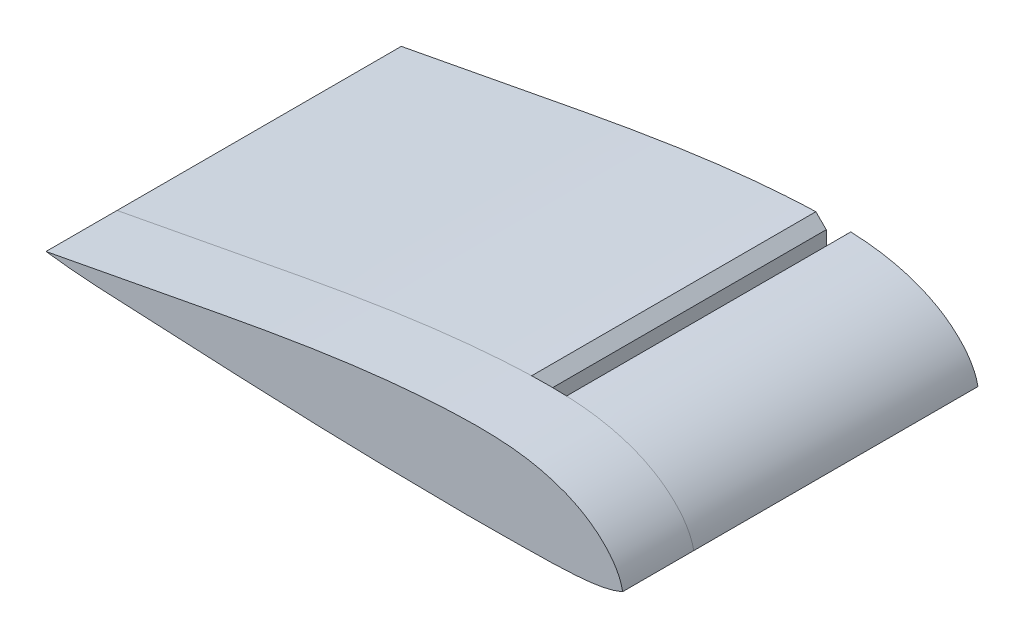
ISO-10303-21;
HEADER;
FILE_DESCRIPTION(('STEP AP214'),'2;1');
FILE_NAME('part.step','',(''),(''),'','','');
FILE_SCHEMA(('AUTOMOTIVE_DESIGN { 1 0 10303 214 1 1 1 1 }'));
ENDSEC;
DATA;
#1=APPLICATION_CONTEXT('core data for automotive mechanical design processes');
#2=APPLICATION_PROTOCOL_DEFINITION('international standard','automotive_design',2000,#1);
#3=PRODUCT_CONTEXT('',#1,'mechanical');
#4=PRODUCT('Part','Part','',(#3));
#5=PRODUCT_RELATED_PRODUCT_CATEGORY('part','',(#4));
#6=PRODUCT_DEFINITION_FORMATION('','',#4);
#7=PRODUCT_DEFINITION_CONTEXT('part definition',#1,'design');
#8=PRODUCT_DEFINITION('design','',#6,#7);
#9=PRODUCT_DEFINITION_SHAPE('','',#8);
#10=(LENGTH_UNIT() NAMED_UNIT(*) SI_UNIT(.MILLI.,.METRE.));
#11=(NAMED_UNIT(*) PLANE_ANGLE_UNIT() SI_UNIT($,.RADIAN.));
#12=(NAMED_UNIT(*) SI_UNIT($,.STERADIAN.) SOLID_ANGLE_UNIT());
#13=UNCERTAINTY_MEASURE_WITH_UNIT(LENGTH_MEASURE(1.E-05),#10,'distance_accuracy_value','');
#14=(GEOMETRIC_REPRESENTATION_CONTEXT(3) GLOBAL_UNCERTAINTY_ASSIGNED_CONTEXT((#13)) GLOBAL_UNIT_ASSIGNED_CONTEXT((#10,
#11,#12)) REPRESENTATION_CONTEXT('',''));
#15=CARTESIAN_POINT('',(0.,0.,0.));
#16=DIRECTION('',(0.,0.,1.));
#17=DIRECTION('',(1.,0.,0.));
#18=AXIS2_PLACEMENT_3D('',#15,#16,#17);
#19=CARTESIAN_POINT('',(0.0525468970362367,-5.46386928669368,40.));
#20=DIRECTION('',(0.,0.,1.));
#21=DIRECTION('',(1.,0.,0.));
#22=AXIS2_PLACEMENT_3D('',#19,#20,#21);
#23=PLANE('',#22);
#24=DIRECTION('',(0.707106781186548,-0.707106781186547,0.));
#25=VECTOR('',#24,1.);
#26=CARTESIAN_POINT('',(8.47373096715155,8.47373096715155,40.));
#27=LINE('',#26,#25);
#28=CARTESIAN_POINT('',(21.2277396024697,-4.28027766816662,40.));
#29=VERTEX_POINT('',#28);
#30=CARTESIAN_POINT('',(22.7130167791552,-5.76555478804223,40.));
#31=VERTEX_POINT('',#30);
#32=EDGE_CURVE('E72',#29,#31,#27,.T.);
#33=ORIENTED_EDGE('',*,*,#32,.T.);
#34=CARTESIAN_POINT('',(17.7318799767407,-5.77499139046754,40.));
#35=CARTESIAN_POINT('',(19.3922506443291,-5.78349573566027,40.));
#36=CARTESIAN_POINT('',(21.0527034694227,-5.78008344112582,40.));
#37=CARTESIAN_POINT('',(22.7130189897741,-5.76581451058722,40.));
#38=B_SPLINE_CURVE_WITH_KNOTS('',3,(#34,#35,#36,#37),.UNSPECIFIED.,.F.,.F.,(4,4),
(0.717206492162273,0.778393618965696),.UNSPECIFIED.);
#39=CARTESIAN_POINT('',(17.731533682026,-5.77554089475236,40.));
#40=VERTEX_POINT('',#39);
#41=EDGE_CURVE('E237',#40,#31,#38,.T.);
#42=ORIENTED_EDGE('',*,*,#41,.F.);
#43=DIRECTION('',(-0.707106781186544,-0.707106781186551,0.));
#44=VECTOR('',#43,1.);
#45=CARTESIAN_POINT('',(11.754008635319,-11.7540086353189,40.));
#46=LINE('',#45,#44);
#47=CARTESIAN_POINT('',(19.2277396024705,-4.28027766816735,40.));
#48=VERTEX_POINT('',#47);
#49=EDGE_CURVE('E438',#48,#40,#46,.T.);
#50=ORIENTED_EDGE('',*,*,#49,.F.);
#51=DIRECTION('',(0.,-1.,0.));
#52=VECTOR('',#51,1.);
#53=CARTESIAN_POINT('',(19.2277396024705,0.,40.));
#54=LINE('',#53,#52);
#55=CARTESIAN_POINT('',(19.2277396024705,4.26653509437403,40.));
#56=VERTEX_POINT('',#55);
#57=EDGE_CURVE('E353',#56,#48,#54,.T.);
#58=ORIENTED_EDGE('',*,*,#57,.F.);
#59=DIRECTION('',(0.707106781186548,-0.707106781186548,0.));
#60=VECTOR('',#59,1.);
#61=CARTESIAN_POINT('',(11.7471373484222,11.7471373484222,40.));
#62=LINE('',#61,#60);
#63=CARTESIAN_POINT('',(17.765326663135,5.72894839080767,40.));
#64=VERTEX_POINT('',#63);
#65=EDGE_CURVE('E392',#64,#56,#62,.T.);
#66=ORIENTED_EDGE('',*,*,#65,.F.);
#67=CARTESIAN_POINT('',(22.6796342102274,5.71872072456708,40.));
#68=CARTESIAN_POINT('',(21.0434973005353,5.78682796876243,40.));
#69=CARTESIAN_POINT('',(19.4033416538222,5.7761747385609,40.));
#70=CARTESIAN_POINT('',(17.7657952986475,5.72759658152388,40.));
#71=CARTESIAN_POINT('',(17.7653666065268,5.72758386167769,40.));
#72=B_SPLINE_CURVE_WITH_KNOTS('',3,(#67,#68,#69,#70,#71),.UNSPECIFIED.,.F.,.F.,(4,1,4),
(0.254493368609213,0.311698812497604,0.31171379219872),.UNSPECIFIED.);
#73=CARTESIAN_POINT('',(22.6796333065328,5.7186989199501,40.));
#74=VERTEX_POINT('',#73);
#75=EDGE_CURVE('E134',#74,#64,#72,.T.);
#76=ORIENTED_EDGE('',*,*,#75,.F.);
#77=DIRECTION('',(-0.707106781186547,-0.707106781186548,0.));
#78=VECTOR('',#77,1.);
#79=CARTESIAN_POINT('',(8.48060225404831,-8.4806022540483,40.));
#80=LINE('',#79,#78);
#81=CARTESIAN_POINT('',(21.2277396024697,4.26653509437313,40.));
#82=VERTEX_POINT('',#81);
#83=EDGE_CURVE('E131',#74,#82,#80,.T.);
#84=ORIENTED_EDGE('',*,*,#83,.T.);
#85=DIRECTION('',(0.,-1.,0.));
#86=VECTOR('',#85,1.);
#87=CARTESIAN_POINT('',(21.2277396024697,0.,40.));
#88=LINE('',#87,#86);
#89=EDGE_CURVE('E67',#82,#29,#88,.T.);
#90=ORIENTED_EDGE('',*,*,#89,.T.);
#91=EDGE_LOOP('',(#33,#42,#50,#58,#66,#76,#84,#90));
#92=FACE_BOUND('',#91,.T.);
#93=ADVANCED_FACE('F47',(#92),#23,.F.);
#94=CARTESIAN_POINT('',(-40.584110619365,-3.29552277093563,40.));
#95=CARTESIAN_POINT('',(-38.0685439131347,-2.8176134024114,40.));
#96=CARTESIAN_POINT('',(-34.5597984085762,-2.15219801041891,40.));
#97=CARTESIAN_POINT('',(-30.0519798961892,-1.29589186215893,40.));
#98=CARTESIAN_POINT('',(-27.1254070167667,-0.738997301391138,40.));
#99=CARTESIAN_POINT('',(-24.3396055931316,-0.207293667857091,40.));
#100=CARTESIAN_POINT('',(-21.5206633020575,0.330335377693454,40.));
#101=CARTESIAN_POINT('',(-18.6945817021849,0.866640247112935,40.));
#102=CARTESIAN_POINT('',(-15.8718392808739,1.39780507622587,40.));
#103=CARTESIAN_POINT('',(-12.6908706499363,1.98695960024896,40.));
#104=CARTESIAN_POINT('',(-8.63705999732918,2.71512650186369,40.));
#105=CARTESIAN_POINT('',(-3.47449666801325,3.57546061479841,40.));
#106=CARTESIAN_POINT('',(2.40504008150446,4.43088123313147,40.));
#107=CARTESIAN_POINT('',(8.08082362993392,5.09618769827598,40.));
#108=CARTESIAN_POINT('',(12.933081441387,5.50377765575714,40.));
#109=CARTESIAN_POINT('',(15.9958967855747,5.66860355071076,40.));
#110=CARTESIAN_POINT('',(19.0841436664227,5.77411696086024,40.));
#111=CARTESIAN_POINT('',(22.1328866117027,5.79161957767961,40.));
#112=CARTESIAN_POINT('',(25.7811654927382,5.52803846455277,40.));
#113=CARTESIAN_POINT('',(29.1472358267562,4.96421170028247,40.));
#114=CARTESIAN_POINT('',(32.464077312301,3.98146617371254,40.));
#115=CARTESIAN_POINT('',(35.6572570778671,2.34542474590238,40.));
#116=CARTESIAN_POINT('',(38.6891570045196,-0.103469562627952,40.));
#117=CARTESIAN_POINT('',(40.2436946620834,-2.47576104327408,40.));
#118=CARTESIAN_POINT('',(40.584110619365,-4.17386498899151,40.));
#119=B_SPLINE_CURVE_WITH_KNOTS('',3,(#94,#95,#96,#97,#98,#99,#100,#101,#102,#103,#104,#105,#106,
#107,#108,#109,#110,#111,#112,#113,#114,#115,#116,#117,#118),.UNSPECIFIED.,.F.,.F.,(4,1,1,1,1,1,
1,1,1,1,1,1,1,1,1,1,1,1,1,1,1,1,4),(0.,0.0894693421938986,0.124785331428715,0.16032571725947,
0.193562526002007,0.223881961830118,0.260598613266335,0.294071822676738,0.324243191259794,
0.37363594302268,0.437982729340681,0.507108403125947,0.581219138343497,0.637621679000005,
0.677222166951578,0.68837569927919,0.745594738698537,0.783660138500158,0.816022268218983,
0.864719544343208,0.903898553812896,0.940606706906168,1.),.UNSPECIFIED.);
#120=DIRECTION('',(0.,0.,-1.));
#121=VECTOR('',#120,1.);
#122=SURFACE_OF_LINEAR_EXTRUSION('',#119,#121);
#123=CARTESIAN_POINT('',(-40.584110619365,-3.29552277093563,0.));
#124=CARTESIAN_POINT('',(-38.0685439131347,-2.8176134024114,0.));
#125=CARTESIAN_POINT('',(-34.5597984085762,-2.15219801041891,0.));
#126=CARTESIAN_POINT('',(-30.0519798961892,-1.29589186215893,0.));
#127=CARTESIAN_POINT('',(-27.1254070167667,-0.738997301391138,0.));
#128=CARTESIAN_POINT('',(-24.3396055931316,-0.207293667857091,0.));
#129=CARTESIAN_POINT('',(-21.5206633020575,0.330335377693454,0.));
#130=CARTESIAN_POINT('',(-18.6945817021849,0.866640247112935,0.));
#131=CARTESIAN_POINT('',(-15.8718392808739,1.39780507622587,0.));
#132=CARTESIAN_POINT('',(-12.6908706499363,1.98695960024896,0.));
#133=CARTESIAN_POINT('',(-8.63705999732918,2.71512650186369,0.));
#134=CARTESIAN_POINT('',(-3.47449666801325,3.57546061479841,0.));
#135=CARTESIAN_POINT('',(2.40504008150446,4.43088123313147,0.));
#136=CARTESIAN_POINT('',(8.08082362993392,5.09618769827598,0.));
#137=CARTESIAN_POINT('',(12.933081441387,5.50377765575714,0.));
#138=CARTESIAN_POINT('',(15.9958967855747,5.66860355071076,0.));
#139=CARTESIAN_POINT('',(19.0841436664227,5.77411696086024,0.));
#140=CARTESIAN_POINT('',(22.1328866117027,5.79161957767961,0.));
#141=CARTESIAN_POINT('',(25.7811654927382,5.52803846455277,0.));
#142=CARTESIAN_POINT('',(29.1472358267562,4.96421170028247,0.));
#143=CARTESIAN_POINT('',(32.464077312301,3.98146617371254,0.));
#144=CARTESIAN_POINT('',(35.6572570778671,2.34542474590238,0.));
#145=CARTESIAN_POINT('',(38.6891570045196,-0.103469562627952,0.));
#146=CARTESIAN_POINT('',(40.2436946620834,-2.47576104327408,0.));
#147=CARTESIAN_POINT('',(40.584110619365,-4.17386498899151,0.));
#148=B_SPLINE_CURVE_WITH_KNOTS('',3,(#123,#124,#125,#126,#127,#128,#129,#130,#131,#132,#133,
#134,#135,#136,#137,#138,#139,#140,#141,#142,#143,#144,#145,#146,#147),.UNSPECIFIED.,.F.,.F.,(4,
1,1,1,1,1,1,1,1,1,1,1,1,1,1,1,1,1,1,1,1,1,4),(0.,0.0894693421938986,0.124785331428715,
0.16032571725947,0.193562526002007,0.223881961830118,0.260598613266335,0.294071822676738,
0.324243191259794,0.37363594302268,0.437982729340681,0.507108403125947,0.581219138343497,
0.637621679000005,0.677222166951578,0.68837569927919,0.745594738698537,0.783660138500158,
0.816022268218983,0.864719544343208,0.903898553812896,0.940606706906168,1.),.UNSPECIFIED.);
#149=CARTESIAN_POINT('',(-40.584110619365,-3.29552277093563,0.));
#150=VERTEX_POINT('',#149);
#151=CARTESIAN_POINT('',(17.7666526834253,5.7276220134192,0.));
#152=VERTEX_POINT('',#151);
#153=EDGE_CURVE('E332',#150,#152,#148,.T.);
#154=ORIENTED_EDGE('',*,*,#153,.F.);
#155=DIRECTION('',(0.,0.,-1.));
#156=VECTOR('',#155,1.);
#157=CARTESIAN_POINT('',(-40.584110619365,-3.29552277093563,40.));
#158=LINE('',#157,#156);
#159=CARTESIAN_POINT('',(-40.584110619365,-3.29552277093563,40.));
#160=VERTEX_POINT('',#159);
#161=EDGE_CURVE('E11',#160,#150,#158,.T.);
#162=ORIENTED_EDGE('',*,*,#161,.F.);
#163=CARTESIAN_POINT('',(-40.584110619365,-3.29552277093563,40.));
#164=CARTESIAN_POINT('',(-38.0685439131347,-2.8176134024114,40.));
#165=CARTESIAN_POINT('',(-34.5597984085762,-2.15219801041891,40.));
#166=CARTESIAN_POINT('',(-30.0519798961892,-1.29589186215893,40.));
#167=CARTESIAN_POINT('',(-27.1254070167667,-0.738997301391138,40.));
#168=CARTESIAN_POINT('',(-24.3396055931316,-0.207293667857091,40.));
#169=CARTESIAN_POINT('',(-21.5206633020575,0.330335377693454,40.));
#170=CARTESIAN_POINT('',(-18.6945817021849,0.866640247112935,40.));
#171=CARTESIAN_POINT('',(-15.8718392808739,1.39780507622587,40.));
#172=CARTESIAN_POINT('',(-12.6908706499363,1.98695960024896,40.));
#173=CARTESIAN_POINT('',(-8.63705999732918,2.71512650186369,40.));
#174=CARTESIAN_POINT('',(-3.47449666801325,3.57546061479841,40.));
#175=CARTESIAN_POINT('',(2.40504008150446,4.43088123313147,40.));
#176=CARTESIAN_POINT('',(8.08082362993392,5.09618769827598,40.));
#177=CARTESIAN_POINT('',(12.933081441387,5.50377765575714,40.));
#178=CARTESIAN_POINT('',(15.9958967855747,5.66860355071076,40.));
#179=CARTESIAN_POINT('',(17.4475639445431,5.71820138347946,40.));
#180=CARTESIAN_POINT('',(17.7666526834253,5.7276220134192,40.));
#181=B_SPLINE_CURVE_WITH_KNOTS('',3,(#163,#164,#165,#166,#167,#168,#169,#170,#171,#172,#173,
#174,#175,#176,#177,#178,#179,#180),.UNSPECIFIED.,.F.,.F.,(4,1,1,1,1,1,1,1,1,1,1,1,1,1,1,4),(0.,
0.0894693421938986,0.124785331428715,0.16032571725947,0.193562526002007,0.223881961830118,
0.260598613266335,0.294071822676738,0.324243191259794,0.37363594302268,0.437982729340681,
0.507108403125947,0.581219138343497,0.637621679000005,0.677222166951578,0.68837569927919),.UNSPECIFIED.);
#182=EDGE_CURVE('E244',#160,#64,#181,.T.);
#183=ORIENTED_EDGE('',*,*,#182,.T.);
#184=DIRECTION('',(0.,0.,-1.));
#185=VECTOR('',#184,1.);
#186=CARTESIAN_POINT('',(17.7666526834253,5.7276220134192,40.));
#187=LINE('',#186,#185);
#188=EDGE_CURVE('E335',#64,#152,#187,.T.);
#189=ORIENTED_EDGE('',*,*,#188,.T.);
#190=EDGE_LOOP('',(#154,#162,#183,#189));
#191=FACE_BOUND('',#190,.T.);
#192=ADVANCED_FACE('F49',(#191),#122,.T.);
#193=CARTESIAN_POINT('',(-40.584110619365,-3.29552277093563,40.));
#194=CARTESIAN_POINT('',(-38.8948235317914,-3.51920496717508,40.));
#195=CARTESIAN_POINT('',(-36.381185748801,-3.79186104989485,40.));
#196=CARTESIAN_POINT('',(-33.0157586578741,-4.00510103264052,40.));
#197=CARTESIAN_POINT('',(-30.4953998194431,-4.12522287274075,40.));
#198=CARTESIAN_POINT('',(-27.9466461707408,-4.23009008225074,40.));
#199=CARTESIAN_POINT('',(-25.2554627425466,-4.35191862827382,40.));
#200=CARTESIAN_POINT('',(-22.4627696581292,-4.49392488534925,40.));
#201=CARTESIAN_POINT('',(-19.8802387056828,-4.62903372671836,40.));
#202=CARTESIAN_POINT('',(-17.3859223272932,-4.75640506743846,40.));
#203=CARTESIAN_POINT('',(-14.3547250221065,-4.90213584107572,40.));
#204=CARTESIAN_POINT('',(-10.7060416021128,-5.06244339831909,40.));
#205=CARTESIAN_POINT('',(-6.92489056245481,-5.21630169359432,40.));
#206=CARTESIAN_POINT('',(-3.48969742865161,-5.3472079106342,40.));
#207=CARTESIAN_POINT('',(-0.266666555232964,-5.45790441513305,40.));
#208=CARTESIAN_POINT('',(3.03468928677292,-5.55116506507864,40.));
#209=CARTESIAN_POINT('',(6.3625746169418,-5.62060126468335,40.));
#210=CARTESIAN_POINT('',(9.58436566390029,-5.67245262758271,40.));
#211=CARTESIAN_POINT('',(12.7430415886771,-5.71889974947835,40.));
#212=CARTESIAN_POINT('',(15.3798627930092,-5.75835044885452,40.));
#213=CARTESIAN_POINT('',(19.0085507980159,-5.79161957767961,40.));
#214=CARTESIAN_POINT('',(22.9154904748856,-5.77087723869822,40.));
#215=CARTESIAN_POINT('',(27.5578845127059,-5.70750959455238,40.));
#216=CARTESIAN_POINT('',(31.2374577794581,-5.65502285667884,40.));
#217=CARTESIAN_POINT('',(35.6434609912588,-5.40633945968658,40.));
#218=CARTESIAN_POINT('',(38.6811552725244,-5.02557104421119,40.));
#219=CARTESIAN_POINT('',(40.584110619365,-4.17386498899151,40.));
#220=B_SPLINE_CURVE_WITH_KNOTS('',3,(#193,#194,#195,#196,#197,#198,#199,#200,#201,#202,#203,
#204,#205,#206,#207,#208,#209,#210,#211,#212,#213,#214,#215,#216,#217,#218,#219),.UNSPECIFIED.,
.F.,.F.,(4,1,1,1,1,1,1,1,1,1,1,1,1,1,1,1,1,1,1,1,1,1,1,1,4),(0.,0.0628046333215733,
0.0931341031292407,0.124267200888339,0.155795103251626,0.187145870852573,0.223549899740897,
0.258850401088304,0.28245336190452,0.315595795067703,0.370691739184793,0.41705215288712,
0.455062490132668,0.49738499008545,0.535904096254302,0.576779070106949,0.620057556452874,
0.654656019916869,0.693202448730655,0.717246105236152,0.788394113275156,0.837175604541533,
0.888381373791807,0.923931665673763,1.),.UNSPECIFIED.);
#221=DIRECTION('',(0.,0.,-1.));
#222=VECTOR('',#221,1.);
#223=SURFACE_OF_LINEAR_EXTRUSION('',#220,#222);
#224=CARTESIAN_POINT('',(-40.584110619365,-3.29552277093563,0.));
#225=CARTESIAN_POINT('',(-38.8948235317914,-3.51920496717508,0.));
#226=CARTESIAN_POINT('',(-36.381185748801,-3.79186104989485,0.));
#227=CARTESIAN_POINT('',(-33.0157586578741,-4.00510103264052,0.));
#228=CARTESIAN_POINT('',(-30.4953998194431,-4.12522287274075,0.));
#229=CARTESIAN_POINT('',(-27.9466461707408,-4.23009008225074,0.));
#230=CARTESIAN_POINT('',(-25.2554627425466,-4.35191862827382,0.));
#231=CARTESIAN_POINT('',(-22.4627696581292,-4.49392488534925,0.));
#232=CARTESIAN_POINT('',(-19.8802387056828,-4.62903372671836,0.));
#233=CARTESIAN_POINT('',(-17.3859223272932,-4.75640506743846,0.));
#234=CARTESIAN_POINT('',(-14.3547250221065,-4.90213584107572,0.));
#235=CARTESIAN_POINT('',(-10.7060416021128,-5.06244339831909,0.));
#236=CARTESIAN_POINT('',(-6.92489056245481,-5.21630169359432,0.));
#237=CARTESIAN_POINT('',(-3.48969742865161,-5.3472079106342,0.));
#238=CARTESIAN_POINT('',(-0.266666555232964,-5.45790441513305,0.));
#239=CARTESIAN_POINT('',(3.03468928677292,-5.55116506507864,0.));
#240=CARTESIAN_POINT('',(6.3625746169418,-5.62060126468335,0.));
#241=CARTESIAN_POINT('',(9.58436566390029,-5.67245262758271,0.));
#242=CARTESIAN_POINT('',(12.7430415886771,-5.71889974947835,0.));
#243=CARTESIAN_POINT('',(15.3798627930092,-5.75835044885452,0.));
#244=CARTESIAN_POINT('',(19.0085507980159,-5.79161957767961,0.));
#245=CARTESIAN_POINT('',(22.9154904748856,-5.77087723869822,0.));
#246=CARTESIAN_POINT('',(27.5578845127059,-5.70750959455238,0.));
#247=CARTESIAN_POINT('',(31.2374577794581,-5.65502285667884,0.));
#248=CARTESIAN_POINT('',(35.6434609912588,-5.40633945968658,0.));
#249=CARTESIAN_POINT('',(38.6811552725244,-5.02557104421119,0.));
#250=CARTESIAN_POINT('',(40.584110619365,-4.17386498899151,0.));
#251=B_SPLINE_CURVE_WITH_KNOTS('',3,(#224,#225,#226,#227,#228,#229,#230,#231,#232,#233,#234,
#235,#236,#237,#238,#239,#240,#241,#242,#243,#244,#245,#246,#247,#248,#249,#250),.UNSPECIFIED.,
.F.,.F.,(4,1,1,1,1,1,1,1,1,1,1,1,1,1,1,1,1,1,1,1,1,1,1,1,4),(0.,0.0628046333215733,
0.0931341031292407,0.124267200888339,0.155795103251626,0.187145870852573,0.223549899740897,
0.258850401088304,0.28245336190452,0.315595795067703,0.370691739184793,0.41705215288712,
0.455062490132668,0.49738499008545,0.535904096254302,0.576779070106949,0.620057556452874,
0.654656019916869,0.693202448730655,0.717246105236152,0.788394113275156,0.837175604541533,
0.888381373791807,0.923931665673763,1.),.UNSPECIFIED.);
#252=CARTESIAN_POINT('',(17.730501202169,-5.77751606846879,0.));
#253=VERTEX_POINT('',#252);
#254=EDGE_CURVE('E341',#150,#253,#251,.T.);
#255=ORIENTED_EDGE('',*,*,#254,.T.);
#256=DIRECTION('',(0.,0.,-1.));
#257=VECTOR('',#256,1.);
#258=CARTESIAN_POINT('',(17.730501202169,-5.77751606846879,40.));
#259=LINE('',#258,#257);
#260=EDGE_CURVE('E59',#40,#253,#259,.T.);
#261=ORIENTED_EDGE('',*,*,#260,.F.);
#262=CARTESIAN_POINT('',(-40.584110619365,-3.29552277093563,40.));
#263=CARTESIAN_POINT('',(-38.8780739937655,-3.52192235304276,40.));
#264=CARTESIAN_POINT('',(-36.1233711999972,-3.81879422458568,40.));
#265=CARTESIAN_POINT('',(-31.95531937462,-4.06583832325401,40.));
#266=CARTESIAN_POINT('',(-28.1071397998488,-4.2203307466361,40.));
#267=CARTESIAN_POINT('',(-23.5827786824483,-4.43169152131761,40.));
#268=CARTESIAN_POINT('',(-19.2584974947614,-4.66407376597151,40.));
#269=CARTESIAN_POINT('',(-15.1550288259625,-4.86517386515093,40.));
#270=CARTESIAN_POINT('',(-11.5664429025192,-5.02524667184353,40.));
#271=CARTESIAN_POINT('',(-8.27772651045568,-5.16203381147918,40.));
#272=CARTESIAN_POINT('',(-4.92008848049807,-5.29370687696436,40.));
#273=CARTESIAN_POINT('',(-0.377238739841641,-5.4599374725744,40.));
#274=CARTESIAN_POINT('',(4.0595895021512,-5.57851774957694,40.));
#275=CARTESIAN_POINT('',(7.8361065203026,-5.64432116650972,40.));
#276=CARTESIAN_POINT('',(9.64660562937286,-5.67285462415701,40.));
#277=CARTESIAN_POINT('',(11.0420495634175,-5.69384699274496,40.));
#278=CARTESIAN_POINT('',(13.2501077526508,-5.7264693580155,40.));
#279=CARTESIAN_POINT('',(15.4646511393581,-5.75992842709683,40.));
#280=CARTESIAN_POINT('',(17.296057459886,-5.77275912679387,40.));
#281=CARTESIAN_POINT('',(17.7318799767407,-5.77499139046754,40.));
#282=B_SPLINE_CURVE_WITH_KNOTS('',3,(#262,#263,#264,#265,#266,#267,#268,#269,#270,#271,#272,
#273,#274,#275,#276,#277,#278,#279,#280,#281),.UNSPECIFIED.,.F.,.F.,(4,1,1,1,1,1,1,1,1,1,1,1,1,
1,1,1,1,4),(0.,0.0634211441785009,0.102053471949526,0.153845936080147,0.205346934593792,
0.268962748855752,0.313431508128509,0.356746662476108,0.40133854483786,0.434730111154983,
0.480575531209856,0.568860845733914,0.598285629681305,0.619766698620965,0.635588638907558,
0.649715570767456,0.701145784681029,0.717206492162273),.UNSPECIFIED.);
#283=EDGE_CURVE('E402',#160,#40,#282,.T.);
#284=ORIENTED_EDGE('',*,*,#283,.F.);
#285=ORIENTED_EDGE('',*,*,#161,.T.);
#286=EDGE_LOOP('',(#255,#261,#284,#285));
#287=FACE_BOUND('',#286,.T.);
#288=ADVANCED_FACE('F322',(#287),#223,.F.);
#289=CARTESIAN_POINT('',(11.754008635319,-11.7540086353189,40.));
#290=DIRECTION('',(0.707106781186551,-0.707106781186544,0.));
#291=DIRECTION('',(0.707106781186544,0.707106781186551,0.));
#292=AXIS2_PLACEMENT_3D('',#289,#290,#291);
#293=PLANE('',#292);
#294=DIRECTION('',(-0.707106781186544,-0.707106781186551,0.));
#295=VECTOR('',#294,1.);
#296=CARTESIAN_POINT('',(11.754008635319,-11.7540086353189,0.));
#297=LINE('',#296,#295);
#298=CARTESIAN_POINT('',(19.2277396024705,-4.28027766816735,0.));
#299=VERTEX_POINT('',#298);
#300=EDGE_CURVE('E347',#299,#253,#297,.T.);
#301=ORIENTED_EDGE('',*,*,#300,.F.);
#302=DIRECTION('',(0.,0.,-1.));
#303=VECTOR('',#302,1.);
#304=CARTESIAN_POINT('',(19.2277396024705,-4.28027766816735,40.));
#305=LINE('',#304,#303);
#306=EDGE_CURVE('E376',#48,#299,#305,.T.);
#307=ORIENTED_EDGE('',*,*,#306,.F.);
#308=ORIENTED_EDGE('',*,*,#49,.T.);
#309=ORIENTED_EDGE('',*,*,#260,.T.);
#310=EDGE_LOOP('',(#301,#307,#308,#309));
#311=FACE_BOUND('',#310,.T.);
#312=ADVANCED_FACE('F327',(#311),#293,.T.);
#313=CARTESIAN_POINT('',(19.2277396024705,0.,40.));
#314=DIRECTION('',(1.,0.,0.));
#315=DIRECTION('',(0.,1.,0.));
#316=AXIS2_PLACEMENT_3D('',#313,#314,#315);
#317=PLANE('',#316);
#318=DIRECTION('',(0.,-1.,0.));
#319=VECTOR('',#318,1.);
#320=CARTESIAN_POINT('',(19.2277396024705,0.,0.));
#321=LINE('',#320,#319);
#322=CARTESIAN_POINT('',(19.2277396024705,4.26653509437403,0.));
#323=VERTEX_POINT('',#322);
#324=EDGE_CURVE('E366',#323,#299,#321,.T.);
#325=ORIENTED_EDGE('',*,*,#324,.F.);
#326=DIRECTION('',(0.,0.,-1.));
#327=VECTOR('',#326,1.);
#328=CARTESIAN_POINT('',(19.2277396024705,4.26653509437403,40.));
#329=LINE('',#328,#327);
#330=EDGE_CURVE('E373',#56,#323,#329,.T.);
#331=ORIENTED_EDGE('',*,*,#330,.F.);
#332=ORIENTED_EDGE('',*,*,#57,.T.);
#333=ORIENTED_EDGE('',*,*,#306,.T.);
#334=EDGE_LOOP('',(#325,#331,#332,#333));
#335=FACE_BOUND('',#334,.T.);
#336=ADVANCED_FACE('F422',(#335),#317,.T.);
#337=CARTESIAN_POINT('',(11.7471373484222,11.7471373484222,40.));
#338=DIRECTION('',(0.707106781186548,0.707106781186548,0.));
#339=DIRECTION('',(-0.707106781186548,0.707106781186548,0.));
#340=AXIS2_PLACEMENT_3D('',#337,#338,#339);
#341=PLANE('',#340);
#342=DIRECTION('',(0.707106781186548,-0.707106781186548,0.));
#343=VECTOR('',#342,1.);
#344=CARTESIAN_POINT('',(11.7471373484222,11.7471373484222,0.));
#345=LINE('',#344,#343);
#346=EDGE_CURVE('E370',#152,#323,#345,.T.);
#347=ORIENTED_EDGE('',*,*,#346,.F.);
#348=ORIENTED_EDGE('',*,*,#188,.F.);
#349=ORIENTED_EDGE('',*,*,#65,.T.);
#350=ORIENTED_EDGE('',*,*,#330,.T.);
#351=EDGE_LOOP('',(#347,#348,#349,#350));
#352=FACE_BOUND('',#351,.T.);
#353=ADVANCED_FACE('F425',(#352),#341,.T.);
#354=CARTESIAN_POINT('',(0.,0.,0.));
#355=DIRECTION('',(0.,0.,1.));
#356=DIRECTION('',(1.,0.,0.));
#357=AXIS2_PLACEMENT_3D('',#354,#355,#356);
#358=PLANE('',#357);
#359=ORIENTED_EDGE('',*,*,#153,.T.);
#360=ORIENTED_EDGE('',*,*,#346,.T.);
#361=ORIENTED_EDGE('',*,*,#324,.T.);
#362=ORIENTED_EDGE('',*,*,#300,.T.);
#363=ORIENTED_EDGE('',*,*,#254,.F.);
#364=EDGE_LOOP('',(#359,#360,#361,#362,#363));
#365=FACE_BOUND('',#364,.T.);
#366=ADVANCED_FACE('F213',(#365),#358,.F.);
#367=CARTESIAN_POINT('',(-40.584110619365,-3.29552277093563,50.));
#368=CARTESIAN_POINT('',(-38.8780739937655,-3.52192235304276,50.));
#369=CARTESIAN_POINT('',(-36.1233711999972,-3.81879422458568,50.));
#370=CARTESIAN_POINT('',(-31.95531937462,-4.06583832325401,50.));
#371=CARTESIAN_POINT('',(-28.1071397998488,-4.2203307466361,50.));
#372=CARTESIAN_POINT('',(-23.5827786824483,-4.43169152131761,50.));
#373=CARTESIAN_POINT('',(-19.2584974947614,-4.66407376597151,50.));
#374=CARTESIAN_POINT('',(-15.1550288259625,-4.86517386515093,50.));
#375=CARTESIAN_POINT('',(-11.5664429025192,-5.02524667184353,50.));
#376=CARTESIAN_POINT('',(-8.27772651045568,-5.16203381147918,50.));
#377=CARTESIAN_POINT('',(-4.92008848049807,-5.29370687696436,50.));
#378=CARTESIAN_POINT('',(-0.377238739841641,-5.4599374725744,50.));
#379=CARTESIAN_POINT('',(4.0595895021512,-5.57851774957694,50.));
#380=CARTESIAN_POINT('',(7.8361065203026,-5.64432116650972,50.));
#381=CARTESIAN_POINT('',(9.64660562937286,-5.67285462415701,50.));
#382=CARTESIAN_POINT('',(11.0420495634175,-5.69384699274496,50.));
#383=CARTESIAN_POINT('',(13.2501077526508,-5.7264693580155,50.));
#384=CARTESIAN_POINT('',(17.1249311606057,-5.78501324785886,50.));
#385=CARTESIAN_POINT('',(20.9141218548121,-5.78372800739508,50.));
#386=CARTESIAN_POINT('',(23.6433820604,-5.75707758605904,50.));
#387=CARTESIAN_POINT('',(24.6399150208365,-5.74590448535034,50.));
#388=CARTESIAN_POINT('',(25.7527356310785,-5.73190736569346,50.));
#389=CARTESIAN_POINT('',(26.8881188472179,-5.71641490988914,50.));
#390=CARTESIAN_POINT('',(28.0632290685407,-5.70022494901737,50.));
#391=CARTESIAN_POINT('',(29.1430631683407,-5.68366495286939,50.));
#392=CARTESIAN_POINT('',(30.2632160511118,-5.66026594624443,50.));
#393=CARTESIAN_POINT('',(31.2683117412286,-5.63094701210205,50.));
#394=CARTESIAN_POINT('',(32.1562529487073,-5.59473544349294,50.));
#395=CARTESIAN_POINT('',(32.8343816703107,-5.56073693399973,50.));
#396=CARTESIAN_POINT('',(33.6052126712402,-5.5160840234856,50.));
#397=CARTESIAN_POINT('',(34.5712029032235,-5.44857770582058,50.));
#398=CARTESIAN_POINT('',(35.9563698545172,-5.32717425214976,50.));
#399=CARTESIAN_POINT('',(37.2563260326528,-5.15298468011574,50.));
#400=CARTESIAN_POINT('',(38.887745466493,-4.80922526129177,50.));
#401=CARTESIAN_POINT('',(39.8953150954967,-4.48260361848883,50.));
#402=CARTESIAN_POINT('',(40.584110619365,-4.17386498899151,50.));
#403=B_SPLINE_CURVE_WITH_KNOTS('',3,(#367,#368,#369,#370,#371,#372,#373,#374,#375,#376,#377,
#378,#379,#380,#381,#382,#383,#384,#385,#386,#387,#388,#389,#390,#391,#392,#393,#394,#395,#396,
#397,#398,#399,#400,#401,#402),.UNSPECIFIED.,.F.,.F.,(4,1,1,1,1,1,1,1,1,1,1,1,1,1,1,1,1,1,1,1,1,
1,1,1,1,1,1,1,1,1,1,1,1,4),(0.,0.0634211441785009,0.102053471949526,0.153845936080147,
0.205346934593792,0.268962748855752,0.313431508128509,0.356746662476108,0.40133854483786,
0.434730111154983,0.480575531209856,0.568860845733914,0.598285629681305,0.619766698620965,
0.635588638907558,0.649715570767456,0.701145784681029,0.7783967546558,0.789342939128885,
0.801727909275653,0.815122717669217,0.830355233041878,0.843572311991655,0.858431367299275,
0.870153239051639,0.884860383153546,0.895485483423308,0.902901748678551,0.909881511599158,
0.923939232602275,0.938584133768908,0.961123859275851,0.972212174970009,1.),.UNSPECIFIED.);
#404=DIRECTION('',(0.,0.,-1.));
#405=VECTOR('',#404,1.);
#406=SURFACE_OF_LINEAR_EXTRUSION('',#403,#405);
#407=ORIENTED_EDGE('',*,*,#283,.T.);
#408=ORIENTED_EDGE('',*,*,#41,.T.);
#409=CARTESIAN_POINT('',(22.7130189897741,-5.76581451058722,40.));
#410=CARTESIAN_POINT('',(22.7131040768703,-5.76581377933954,40.));
#411=CARTESIAN_POINT('',(23.0102143854749,-5.76326028175019,40.));
#412=CARTESIAN_POINT('',(23.6433820604,-5.75707758605904,40.));
#413=CARTESIAN_POINT('',(24.6399150208365,-5.74590448535034,40.));
#414=CARTESIAN_POINT('',(25.7527356310785,-5.73190736569346,40.));
#415=CARTESIAN_POINT('',(26.8881188472179,-5.71641490988914,40.));
#416=CARTESIAN_POINT('',(28.0632290685407,-5.70022494901737,40.));
#417=CARTESIAN_POINT('',(29.1430631683407,-5.68366495286939,40.));
#418=CARTESIAN_POINT('',(30.2632160511118,-5.66026594624443,40.));
#419=CARTESIAN_POINT('',(31.2683117412286,-5.63094701210205,40.));
#420=CARTESIAN_POINT('',(32.1562529487073,-5.59473544349294,40.));
#421=CARTESIAN_POINT('',(32.8343816703107,-5.56073693399973,40.));
#422=CARTESIAN_POINT('',(33.6052126712402,-5.5160840234856,40.));
#423=CARTESIAN_POINT('',(34.5712029032235,-5.44857770582058,40.));
#424=CARTESIAN_POINT('',(35.9563698545172,-5.32717425214976,40.));
#425=CARTESIAN_POINT('',(37.2563260326528,-5.15298468011574,40.));
#426=CARTESIAN_POINT('',(38.887745466493,-4.80922526129177,40.));
#427=CARTESIAN_POINT('',(39.8953150954967,-4.48260361848883,40.));
#428=CARTESIAN_POINT('',(40.584110619365,-4.17386498899151,40.));
#429=B_SPLINE_CURVE_WITH_KNOTS('',3,(#409,#410,#411,#412,#413,#414,#415,#416,#417,#418,#419,
#420,#421,#422,#423,#424,#425,#426,#427,#428),.UNSPECIFIED.,.F.,.F.,(4,1,1,1,1,1,1,1,1,1,1,1,1,
1,1,1,1,4),(0.778393618965696,0.7783967546558,0.789342939128885,0.801727909275653,
0.815122717669217,0.830355233041878,0.843572311991655,0.858431367299275,0.870153239051639,
0.884860383153546,0.895485483423308,0.902901748678551,0.909881511599158,0.923939232602275,
0.938584133768908,0.961123859275851,0.972212174970009,1.),.UNSPECIFIED.);
#430=CARTESIAN_POINT('',(40.584110619365,-4.17386498899151,40.));
#431=VERTEX_POINT('',#430);
#432=EDGE_CURVE('E139',#31,#431,#429,.T.);
#433=ORIENTED_EDGE('',*,*,#432,.T.);
#434=DIRECTION('',(0.,0.,-1.));
#435=VECTOR('',#434,1.);
#436=CARTESIAN_POINT('',(40.584110619365,-4.17386498899151,50.));
#437=LINE('',#436,#435);
#438=CARTESIAN_POINT('',(40.584110619365,-4.17386498899151,50.));
#439=VERTEX_POINT('',#438);
#440=EDGE_CURVE('E342',#439,#431,#437,.T.);
#441=ORIENTED_EDGE('',*,*,#440,.F.);
#442=CARTESIAN_POINT('',(-40.584110619365,-3.29552277093563,50.));
#443=VERTEX_POINT('',#442);
#444=EDGE_CURVE('E190',#443,#439,#403,.T.);
#445=ORIENTED_EDGE('',*,*,#444,.F.);
#446=DIRECTION('',(0.,0.,-1.));
#447=VECTOR('',#446,1.);
#448=CARTESIAN_POINT('',(-40.584110619365,-3.29552277093563,50.));
#449=LINE('',#448,#447);
#450=EDGE_CURVE('E349',#443,#160,#449,.T.);
#451=ORIENTED_EDGE('',*,*,#450,.T.);
#452=EDGE_LOOP('',(#407,#408,#433,#441,#445,#451));
#453=FACE_BOUND('',#452,.T.);
#454=ADVANCED_FACE('F207',(#453),#406,.F.);
#455=CARTESIAN_POINT('',(40.584110619365,-4.17386498899151,50.));
#456=CARTESIAN_POINT('',(40.262585091359,-2.56822422893694,50.));
#457=CARTESIAN_POINT('',(39.0490205938188,-0.63774075328316,50.));
#458=CARTESIAN_POINT('',(36.9311686997301,1.33490346143591,50.));
#459=CARTESIAN_POINT('',(35.290500413889,2.49665331914602,50.));
#460=CARTESIAN_POINT('',(33.194116746177,3.60953041972957,50.));
#461=CARTESIAN_POINT('',(30.7431080619573,4.51724068809454,50.));
#462=CARTESIAN_POINT('',(28.1452638938645,5.14456342002953,50.));
#463=CARTESIAN_POINT('',(25.7840578296864,5.50550092088037,50.));
#464=CARTESIAN_POINT('',(22.365052482645,5.79099968750829,50.));
#465=CARTESIAN_POINT('',(18.8900763869438,5.78357152257041,50.));
#466=CARTESIAN_POINT('',(15.0058188460708,5.62315482963431,50.));
#467=CARTESIAN_POINT('',(11.6269572269719,5.40262514358599,50.));
#468=CARTESIAN_POINT('',(8.11916673139595,5.08148158048562,50.));
#469=CARTESIAN_POINT('',(4.72173553763716,4.70053607093435,50.));
#470=CARTESIAN_POINT('',(1.66641534184592,4.31153601686901,50.));
#471=CARTESIAN_POINT('',(-1.68093903075065,3.83732618734297,50.));
#472=CARTESIAN_POINT('',(-5.51927444463595,3.23878219330361,50.));
#473=CARTESIAN_POINT('',(-9.38279040999667,2.58158305356859,50.));
#474=CARTESIAN_POINT('',(-13.180401754066,1.89774768257054,50.));
#475=CARTESIAN_POINT('',(-17.0091690300839,1.18587487029729,50.));
#476=CARTESIAN_POINT('',(-21.2858735102251,0.375732657537467,50.));
#477=CARTESIAN_POINT('',(-25.0998008818729,-0.352626409357029,50.));
#478=CARTESIAN_POINT('',(-28.4540240910944,-0.991984799944855,50.));
#479=CARTESIAN_POINT('',(-31.3648834025819,-1.5454016884799,50.));
#480=CARTESIAN_POINT('',(-34.4524258998559,-2.13158237845415,50.));
#481=CARTESIAN_POINT('',(-37.544135902176,-2.71826638446948,50.));
#482=CARTESIAN_POINT('',(-39.5100552005438,-3.09147337951755,50.));
#483=CARTESIAN_POINT('',(-40.584110619365,-3.29552277093563,50.));
#484=B_SPLINE_CURVE_WITH_KNOTS('',3,(#455,#456,#457,#458,#459,#460,#461,#462,#463,#464,#465,
#466,#467,#468,#469,#470,#471,#472,#473,#474,#475,#476,#477,#478,#479,#480,#481,#482,#483),
.UNSPECIFIED.,.F.,.F.,(4,1,1,1,1,1,1,1,1,1,1,1,1,1,1,1,1,1,1,1,1,1,1,1,1,1,4),(0.,
0.0559393597251162,0.0776145823041239,0.100890217100499,0.125955742154103,0.160338903216513,
0.191893063707061,0.219180593186896,0.243711381396795,0.311698812497604,0.34037641790492,
0.379546561005706,0.429978852028651,0.463428053026114,0.498983120915486,0.53758127270959,
0.581539478565935,0.634700454188191,0.674496771823909,0.716350746381937,0.770759156745684,
0.826570277057762,0.852007070688744,0.890056493242623,0.930089448339051,0.961804251047414,1.),.UNSPECIFIED.);
#485=DIRECTION('',(0.,0.,-1.));
#486=VECTOR('',#485,1.);
#487=SURFACE_OF_LINEAR_EXTRUSION('',#484,#486);
#488=CARTESIAN_POINT('',(22.6793715384522,5.71816703035563,40.));
#489=CARTESIAN_POINT('',(23.7682694883486,5.67346631882223,40.));
#490=CARTESIAN_POINT('',(25.7811654927382,5.52803846455277,40.));
#491=CARTESIAN_POINT('',(29.1472358267562,4.96421170028247,40.));
#492=CARTESIAN_POINT('',(32.464077312301,3.98146617371254,40.));
#493=CARTESIAN_POINT('',(35.6572570778671,2.34542474590238,40.));
#494=CARTESIAN_POINT('',(38.6891570045196,-0.103469562627952,40.));
#495=CARTESIAN_POINT('',(40.2436946620834,-2.47576104327408,40.));
#496=CARTESIAN_POINT('',(40.584110619365,-4.17386498899151,40.));
#497=B_SPLINE_CURVE_WITH_KNOTS('',3,(#488,#489,#490,#491,#492,#493,#494,#495,#496),
.UNSPECIFIED.,.F.,.F.,(4,1,1,1,1,1,4),(0.745594738698537,0.783660138500158,0.816022268218983,
0.864719544343208,0.903898553812896,0.940606706906168,1.),.UNSPECIFIED.);
#498=EDGE_CURVE('E198',#74,#431,#497,.T.);
#499=ORIENTED_EDGE('',*,*,#498,.F.);
#500=ORIENTED_EDGE('',*,*,#75,.T.);
#501=ORIENTED_EDGE('',*,*,#182,.F.);
#502=ORIENTED_EDGE('',*,*,#450,.F.);
#503=EDGE_CURVE('E197',#439,#443,#484,.T.);
#504=ORIENTED_EDGE('',*,*,#503,.F.);
#505=ORIENTED_EDGE('',*,*,#440,.T.);
#506=EDGE_LOOP('',(#499,#500,#501,#502,#504,#505));
#507=FACE_BOUND('',#506,.T.);
#508=ADVANCED_FACE('F212',(#507),#487,.F.);
#509=CARTESIAN_POINT('',(0.0525468970362367,-5.46386928669368,50.));
#510=DIRECTION('',(0.,0.,1.));
#511=DIRECTION('',(1.,0.,0.));
#512=AXIS2_PLACEMENT_3D('',#509,#510,#511);
#513=PLANE('',#512);
#514=ORIENTED_EDGE('',*,*,#444,.T.);
#515=ORIENTED_EDGE('',*,*,#503,.T.);
#516=EDGE_LOOP('',(#514,#515));
#517=FACE_BOUND('',#516,.T.);
#518=ADVANCED_FACE('F312',(#517),#513,.T.);
#519=CARTESIAN_POINT('',(8.47373096715155,8.47373096715155,40.));
#520=DIRECTION('',(0.707106781186547,0.707106781186548,0.));
#521=DIRECTION('',(-0.707106781186548,0.707106781186547,0.));
#522=AXIS2_PLACEMENT_3D('',#519,#520,#521);
#523=PLANE('',#522);
#524=DIRECTION('',(0.707106781186548,-0.707106781186547,0.));
#525=VECTOR('',#524,1.);
#526=CARTESIAN_POINT('',(8.47373096715155,8.47373096715155,0.));
#527=LINE('',#526,#525);
#528=CARTESIAN_POINT('',(21.2277396024697,-4.28027766816662,0.));
#529=VERTEX_POINT('',#528);
#530=CARTESIAN_POINT('',(22.7132742510618,-5.76581231675865,0.));
#531=VERTEX_POINT('',#530);
#532=EDGE_CURVE('E163',#529,#531,#527,.T.);
#533=ORIENTED_EDGE('',*,*,#532,.T.);
#534=DIRECTION('',(0.,0.,-1.));
#535=VECTOR('',#534,1.);
#536=CARTESIAN_POINT('',(22.7132742510618,-5.76581231675865,40.));
#537=LINE('',#536,#535);
#538=EDGE_CURVE('E274',#31,#531,#537,.T.);
#539=ORIENTED_EDGE('',*,*,#538,.F.);
#540=ORIENTED_EDGE('',*,*,#32,.F.);
#541=DIRECTION('',(0.,0.,-1.));
#542=VECTOR('',#541,1.);
#543=CARTESIAN_POINT('',(21.2277396024697,-4.28027766816662,40.));
#544=LINE('',#543,#542);
#545=EDGE_CURVE('E149',#29,#529,#544,.T.);
#546=ORIENTED_EDGE('',*,*,#545,.T.);
#547=EDGE_LOOP('',(#533,#539,#540,#546));
#548=FACE_BOUND('',#547,.T.);
#549=ADVANCED_FACE('F301',(#548),#523,.F.);
#550=CARTESIAN_POINT('',(-40.584110619365,-3.29552277093563,40.));
#551=CARTESIAN_POINT('',(-38.8948235317914,-3.51920496717508,40.));
#552=CARTESIAN_POINT('',(-36.381185748801,-3.79186104989485,40.));
#553=CARTESIAN_POINT('',(-33.0157586578741,-4.00510103264052,40.));
#554=CARTESIAN_POINT('',(-30.4953998194431,-4.12522287274075,40.));
#555=CARTESIAN_POINT('',(-27.9466461707408,-4.23009008225074,40.));
#556=CARTESIAN_POINT('',(-25.2554627425466,-4.35191862827382,40.));
#557=CARTESIAN_POINT('',(-22.4627696581292,-4.49392488534925,40.));
#558=CARTESIAN_POINT('',(-19.8802387056828,-4.62903372671836,40.));
#559=CARTESIAN_POINT('',(-17.3859223272932,-4.75640506743846,40.));
#560=CARTESIAN_POINT('',(-14.3547250221065,-4.90213584107572,40.));
#561=CARTESIAN_POINT('',(-10.7060416021128,-5.06244339831909,40.));
#562=CARTESIAN_POINT('',(-6.92489056245481,-5.21630169359432,40.));
#563=CARTESIAN_POINT('',(-3.48969742865161,-5.3472079106342,40.));
#564=CARTESIAN_POINT('',(-0.266666555232964,-5.45790441513305,40.));
#565=CARTESIAN_POINT('',(3.03468928677292,-5.55116506507864,40.));
#566=CARTESIAN_POINT('',(6.3625746169418,-5.62060126468335,40.));
#567=CARTESIAN_POINT('',(9.58436566390029,-5.67245262758271,40.));
#568=CARTESIAN_POINT('',(12.7430415886771,-5.71889974947835,40.));
#569=CARTESIAN_POINT('',(15.3798627930092,-5.75835044885452,40.));
#570=CARTESIAN_POINT('',(19.0085507980159,-5.79161957767961,40.));
#571=CARTESIAN_POINT('',(22.9154904748856,-5.77087723869822,40.));
#572=CARTESIAN_POINT('',(27.5578845127059,-5.70750959455238,40.));
#573=CARTESIAN_POINT('',(31.2374577794581,-5.65502285667884,40.));
#574=CARTESIAN_POINT('',(35.6434609912588,-5.40633945968658,40.));
#575=CARTESIAN_POINT('',(38.6811552725244,-5.02557104421119,40.));
#576=CARTESIAN_POINT('',(40.584110619365,-4.17386498899151,40.));
#577=B_SPLINE_CURVE_WITH_KNOTS('',3,(#550,#551,#552,#553,#554,#555,#556,#557,#558,#559,#560,
#561,#562,#563,#564,#565,#566,#567,#568,#569,#570,#571,#572,#573,#574,#575,#576),.UNSPECIFIED.,
.F.,.F.,(4,1,1,1,1,1,1,1,1,1,1,1,1,1,1,1,1,1,1,1,1,1,1,1,4),(0.,0.0628046333215733,
0.0931341031292407,0.124267200888339,0.155795103251626,0.187145870852573,0.223549899740897,
0.258850401088304,0.28245336190452,0.315595795067703,0.370691739184793,0.41705215288712,
0.455062490132668,0.49738499008545,0.535904096254302,0.576779070106949,0.620057556452874,
0.654656019916869,0.693202448730655,0.717246105236152,0.788394113275156,0.837175604541533,
0.888381373791807,0.923931665673763,1.),.UNSPECIFIED.);
#578=DIRECTION('',(0.,0.,-1.));
#579=VECTOR('',#578,1.);
#580=SURFACE_OF_LINEAR_EXTRUSION('',#577,#579);
#581=CARTESIAN_POINT('',(-40.584110619365,-3.29552277093563,0.));
#582=CARTESIAN_POINT('',(-38.8948235317914,-3.51920496717508,0.));
#583=CARTESIAN_POINT('',(-36.381185748801,-3.79186104989485,0.));
#584=CARTESIAN_POINT('',(-33.0157586578741,-4.00510103264052,0.));
#585=CARTESIAN_POINT('',(-30.4953998194431,-4.12522287274075,0.));
#586=CARTESIAN_POINT('',(-27.9466461707408,-4.23009008225074,0.));
#587=CARTESIAN_POINT('',(-25.2554627425466,-4.35191862827382,0.));
#588=CARTESIAN_POINT('',(-22.4627696581292,-4.49392488534925,0.));
#589=CARTESIAN_POINT('',(-19.8802387056828,-4.62903372671836,0.));
#590=CARTESIAN_POINT('',(-17.3859223272932,-4.75640506743846,0.));
#591=CARTESIAN_POINT('',(-14.3547250221065,-4.90213584107572,0.));
#592=CARTESIAN_POINT('',(-10.7060416021128,-5.06244339831909,0.));
#593=CARTESIAN_POINT('',(-6.92489056245481,-5.21630169359432,0.));
#594=CARTESIAN_POINT('',(-3.48969742865161,-5.3472079106342,0.));
#595=CARTESIAN_POINT('',(-0.266666555232964,-5.45790441513305,0.));
#596=CARTESIAN_POINT('',(3.03468928677292,-5.55116506507864,0.));
#597=CARTESIAN_POINT('',(6.3625746169418,-5.62060126468335,0.));
#598=CARTESIAN_POINT('',(9.58436566390029,-5.67245262758271,0.));
#599=CARTESIAN_POINT('',(12.7430415886771,-5.71889974947835,0.));
#600=CARTESIAN_POINT('',(15.3798627930092,-5.75835044885452,0.));
#601=CARTESIAN_POINT('',(19.0085507980159,-5.79161957767961,0.));
#602=CARTESIAN_POINT('',(22.9154904748856,-5.77087723869822,0.));
#603=CARTESIAN_POINT('',(27.5578845127059,-5.70750959455238,0.));
#604=CARTESIAN_POINT('',(31.2374577794581,-5.65502285667884,0.));
#605=CARTESIAN_POINT('',(35.6434609912588,-5.40633945968658,0.));
#606=CARTESIAN_POINT('',(38.6811552725244,-5.02557104421119,0.));
#607=CARTESIAN_POINT('',(40.584110619365,-4.17386498899151,0.));
#608=B_SPLINE_CURVE_WITH_KNOTS('',3,(#581,#582,#583,#584,#585,#586,#587,#588,#589,#590,#591,
#592,#593,#594,#595,#596,#597,#598,#599,#600,#601,#602,#603,#604,#605,#606,#607),.UNSPECIFIED.,
.F.,.F.,(4,1,1,1,1,1,1,1,1,1,1,1,1,1,1,1,1,1,1,1,1,1,1,1,4),(0.,0.0628046333215733,
0.0931341031292407,0.124267200888339,0.155795103251626,0.187145870852573,0.223549899740897,
0.258850401088304,0.28245336190452,0.315595795067703,0.370691739184793,0.41705215288712,
0.455062490132668,0.49738499008545,0.535904096254302,0.576779070106949,0.620057556452874,
0.654656019916869,0.693202448730655,0.717246105236152,0.788394113275156,0.837175604541533,
0.888381373791807,0.923931665673763,1.),.UNSPECIFIED.);
#609=CARTESIAN_POINT('',(40.584110619365,-4.17386498899151,0.));
#610=VERTEX_POINT('',#609);
#611=EDGE_CURVE('E167',#531,#610,#608,.T.);
#612=ORIENTED_EDGE('',*,*,#611,.T.);
#613=DIRECTION('',(0.,0.,-1.));
#614=VECTOR('',#613,1.);
#615=CARTESIAN_POINT('',(40.584110619365,-4.17386498899151,40.));
#616=LINE('',#615,#614);
#617=EDGE_CURVE('E278',#431,#610,#616,.T.);
#618=ORIENTED_EDGE('',*,*,#617,.F.);
#619=ORIENTED_EDGE('',*,*,#432,.F.);
#620=ORIENTED_EDGE('',*,*,#538,.T.);
#621=EDGE_LOOP('',(#612,#618,#619,#620));
#622=FACE_BOUND('',#621,.T.);
#623=ADVANCED_FACE('F290',(#622),#580,.F.);
#624=CARTESIAN_POINT('',(-40.584110619365,-3.29552277093563,40.));
#625=CARTESIAN_POINT('',(-38.0685439131347,-2.8176134024114,40.));
#626=CARTESIAN_POINT('',(-34.5597984085762,-2.15219801041891,40.));
#627=CARTESIAN_POINT('',(-30.0519798961892,-1.29589186215893,40.));
#628=CARTESIAN_POINT('',(-27.1254070167667,-0.738997301391138,40.));
#629=CARTESIAN_POINT('',(-24.3396055931316,-0.207293667857091,40.));
#630=CARTESIAN_POINT('',(-21.5206633020575,0.330335377693454,40.));
#631=CARTESIAN_POINT('',(-18.6945817021849,0.866640247112935,40.));
#632=CARTESIAN_POINT('',(-15.8718392808739,1.39780507622587,40.));
#633=CARTESIAN_POINT('',(-12.6908706499363,1.98695960024896,40.));
#634=CARTESIAN_POINT('',(-8.63705999732918,2.71512650186369,40.));
#635=CARTESIAN_POINT('',(-3.47449666801325,3.57546061479841,40.));
#636=CARTESIAN_POINT('',(2.40504008150446,4.43088123313147,40.));
#637=CARTESIAN_POINT('',(8.08082362993392,5.09618769827598,40.));
#638=CARTESIAN_POINT('',(12.933081441387,5.50377765575714,40.));
#639=CARTESIAN_POINT('',(15.9958967855747,5.66860355071076,40.));
#640=CARTESIAN_POINT('',(19.0841436664227,5.77411696086024,40.));
#641=CARTESIAN_POINT('',(22.1328866117027,5.79161957767961,40.));
#642=CARTESIAN_POINT('',(25.7811654927382,5.52803846455277,40.));
#643=CARTESIAN_POINT('',(29.1472358267562,4.96421170028247,40.));
#644=CARTESIAN_POINT('',(32.464077312301,3.98146617371254,40.));
#645=CARTESIAN_POINT('',(35.6572570778671,2.34542474590238,40.));
#646=CARTESIAN_POINT('',(38.6891570045196,-0.103469562627952,40.));
#647=CARTESIAN_POINT('',(40.2436946620834,-2.47576104327408,40.));
#648=CARTESIAN_POINT('',(40.584110619365,-4.17386498899151,40.));
#649=B_SPLINE_CURVE_WITH_KNOTS('',3,(#624,#625,#626,#627,#628,#629,#630,#631,#632,#633,#634,
#635,#636,#637,#638,#639,#640,#641,#642,#643,#644,#645,#646,#647,#648),.UNSPECIFIED.,.F.,.F.,(4,
1,1,1,1,1,1,1,1,1,1,1,1,1,1,1,1,1,1,1,1,1,4),(0.,0.0894693421938986,0.124785331428715,
0.16032571725947,0.193562526002007,0.223881961830118,0.260598613266335,0.294071822676738,
0.324243191259794,0.37363594302268,0.437982729340681,0.507108403125947,0.581219138343497,
0.637621679000005,0.677222166951578,0.68837569927919,0.745594738698537,0.783660138500158,
0.816022268218983,0.864719544343208,0.903898553812896,0.940606706906168,1.),.UNSPECIFIED.);
#650=DIRECTION('',(0.,0.,-1.));
#651=VECTOR('',#650,1.);
#652=SURFACE_OF_LINEAR_EXTRUSION('',#649,#651);
#653=CARTESIAN_POINT('',(-40.584110619365,-3.29552277093563,0.));
#654=CARTESIAN_POINT('',(-38.0685439131347,-2.8176134024114,0.));
#655=CARTESIAN_POINT('',(-34.5597984085762,-2.15219801041891,0.));
#656=CARTESIAN_POINT('',(-30.0519798961892,-1.29589186215893,0.));
#657=CARTESIAN_POINT('',(-27.1254070167667,-0.738997301391138,0.));
#658=CARTESIAN_POINT('',(-24.3396055931316,-0.207293667857091,0.));
#659=CARTESIAN_POINT('',(-21.5206633020575,0.330335377693454,0.));
#660=CARTESIAN_POINT('',(-18.6945817021849,0.866640247112935,0.));
#661=CARTESIAN_POINT('',(-15.8718392808739,1.39780507622587,0.));
#662=CARTESIAN_POINT('',(-12.6908706499363,1.98695960024896,0.));
#663=CARTESIAN_POINT('',(-8.63705999732918,2.71512650186369,0.));
#664=CARTESIAN_POINT('',(-3.47449666801325,3.57546061479841,0.));
#665=CARTESIAN_POINT('',(2.40504008150446,4.43088123313147,0.));
#666=CARTESIAN_POINT('',(8.08082362993392,5.09618769827598,0.));
#667=CARTESIAN_POINT('',(12.933081441387,5.50377765575714,0.));
#668=CARTESIAN_POINT('',(15.9958967855747,5.66860355071076,0.));
#669=CARTESIAN_POINT('',(19.0841436664227,5.77411696086024,0.));
#670=CARTESIAN_POINT('',(22.1328866117027,5.79161957767961,0.));
#671=CARTESIAN_POINT('',(25.7811654927382,5.52803846455277,0.));
#672=CARTESIAN_POINT('',(29.1472358267562,4.96421170028247,0.));
#673=CARTESIAN_POINT('',(32.464077312301,3.98146617371254,0.));
#674=CARTESIAN_POINT('',(35.6572570778671,2.34542474590238,0.));
#675=CARTESIAN_POINT('',(38.6891570045196,-0.103469562627952,0.));
#676=CARTESIAN_POINT('',(40.2436946620834,-2.47576104327408,0.));
#677=CARTESIAN_POINT('',(40.584110619365,-4.17386498899151,0.));
#678=B_SPLINE_CURVE_WITH_KNOTS('',3,(#653,#654,#655,#656,#657,#658,#659,#660,#661,#662,#663,
#664,#665,#666,#667,#668,#669,#670,#671,#672,#673,#674,#675,#676,#677),.UNSPECIFIED.,.F.,.F.,(4,
1,1,1,1,1,1,1,1,1,1,1,1,1,1,1,1,1,1,1,1,1,4),(0.,0.0894693421938986,0.124785331428715,
0.16032571725947,0.193562526002007,0.223881961830118,0.260598613266335,0.294071822676738,
0.324243191259794,0.37363594302268,0.437982729340681,0.507108403125947,0.581219138343497,
0.637621679000005,0.677222166951578,0.68837569927919,0.745594738698537,0.783660138500158,
0.816022268218983,0.864719544343208,0.903898553812896,0.940606706906168,1.),.UNSPECIFIED.);
#679=CARTESIAN_POINT('',(22.6793715384522,5.71816703035563,0.));
#680=VERTEX_POINT('',#679);
#681=EDGE_CURVE('E173',#680,#610,#678,.T.);
#682=ORIENTED_EDGE('',*,*,#681,.F.);
#683=DIRECTION('',(0.,0.,-1.));
#684=VECTOR('',#683,1.);
#685=CARTESIAN_POINT('',(22.6793715384522,5.71816703035563,40.));
#686=LINE('',#685,#684);
#687=EDGE_CURVE('E148',#74,#680,#686,.T.);
#688=ORIENTED_EDGE('',*,*,#687,.F.);
#689=ORIENTED_EDGE('',*,*,#498,.T.);
#690=ORIENTED_EDGE('',*,*,#617,.T.);
#691=EDGE_LOOP('',(#682,#688,#689,#690));
#692=FACE_BOUND('',#691,.T.);
#693=ADVANCED_FACE('F300',(#692),#652,.T.);
#694=CARTESIAN_POINT('',(8.48060225404831,-8.4806022540483,40.));
#695=DIRECTION('',(0.707106781186548,-0.707106781186547,0.));
#696=DIRECTION('',(0.707106781186547,0.707106781186548,0.));
#697=AXIS2_PLACEMENT_3D('',#694,#695,#696);
#698=PLANE('',#697);
#699=DIRECTION('',(-0.707106781186547,-0.707106781186548,0.));
#700=VECTOR('',#699,1.);
#701=CARTESIAN_POINT('',(8.48060225404831,-8.4806022540483,0.));
#702=LINE('',#701,#700);
#703=CARTESIAN_POINT('',(21.2277396024697,4.26653509437313,0.));
#704=VERTEX_POINT('',#703);
#705=EDGE_CURVE('E144',#680,#704,#702,.T.);
#706=ORIENTED_EDGE('',*,*,#705,.T.);
#707=DIRECTION('',(0.,0.,-1.));
#708=VECTOR('',#707,1.);
#709=CARTESIAN_POINT('',(21.2277396024697,4.26653509437313,40.));
#710=LINE('',#709,#708);
#711=EDGE_CURVE('E141',#82,#704,#710,.T.);
#712=ORIENTED_EDGE('',*,*,#711,.F.);
#713=ORIENTED_EDGE('',*,*,#83,.F.);
#714=ORIENTED_EDGE('',*,*,#687,.T.);
#715=EDGE_LOOP('',(#706,#712,#713,#714));
#716=FACE_BOUND('',#715,.T.);
#717=ADVANCED_FACE('F142',(#716),#698,.F.);
#718=CARTESIAN_POINT('',(21.2277396024697,0.,40.));
#719=DIRECTION('',(1.,0.,0.));
#720=DIRECTION('',(0.,0.,-1.));
#721=AXIS2_PLACEMENT_3D('',#718,#719,#720);
#722=PLANE('',#721);
#723=DIRECTION('',(0.,-1.,0.));
#724=VECTOR('',#723,1.);
#725=CARTESIAN_POINT('',(21.2277396024697,0.,0.));
#726=LINE('',#725,#724);
#727=EDGE_CURVE('E187',#704,#529,#726,.T.);
#728=ORIENTED_EDGE('',*,*,#727,.T.);
#729=ORIENTED_EDGE('',*,*,#545,.F.);
#730=ORIENTED_EDGE('',*,*,#89,.F.);
#731=ORIENTED_EDGE('',*,*,#711,.T.);
#732=EDGE_LOOP('',(#728,#729,#730,#731));
#733=FACE_BOUND('',#732,.T.);
#734=ADVANCED_FACE('F151',(#733),#722,.F.);
#735=CARTESIAN_POINT('',(0.,0.,0.));
#736=DIRECTION('',(0.,0.,1.));
#737=DIRECTION('',(1.,0.,0.));
#738=AXIS2_PLACEMENT_3D('',#735,#736,#737);
#739=PLANE('',#738);
#740=ORIENTED_EDGE('',*,*,#532,.F.);
#741=ORIENTED_EDGE('',*,*,#727,.F.);
#742=ORIENTED_EDGE('',*,*,#705,.F.);
#743=ORIENTED_EDGE('',*,*,#681,.T.);
#744=ORIENTED_EDGE('',*,*,#611,.F.);
#745=EDGE_LOOP('',(#740,#741,#742,#743,#744));
#746=FACE_BOUND('',#745,.T.);
#747=ADVANCED_FACE('F473',(#746),#739,.F.);
#748=CLOSED_SHELL('',(#93,#192,#288,#312,#336,#353,#366,#454,#508,#518,#549,#623,#693,#717,#734,#747));
#749=MANIFOLD_SOLID_BREP('B2',#748);
#750=ADVANCED_BREP_SHAPE_REPRESENTATION('',(#18,#749),#14);
#751=SHAPE_DEFINITION_REPRESENTATION(#9,#750);
ENDSEC;
END-ISO-10303-21;
